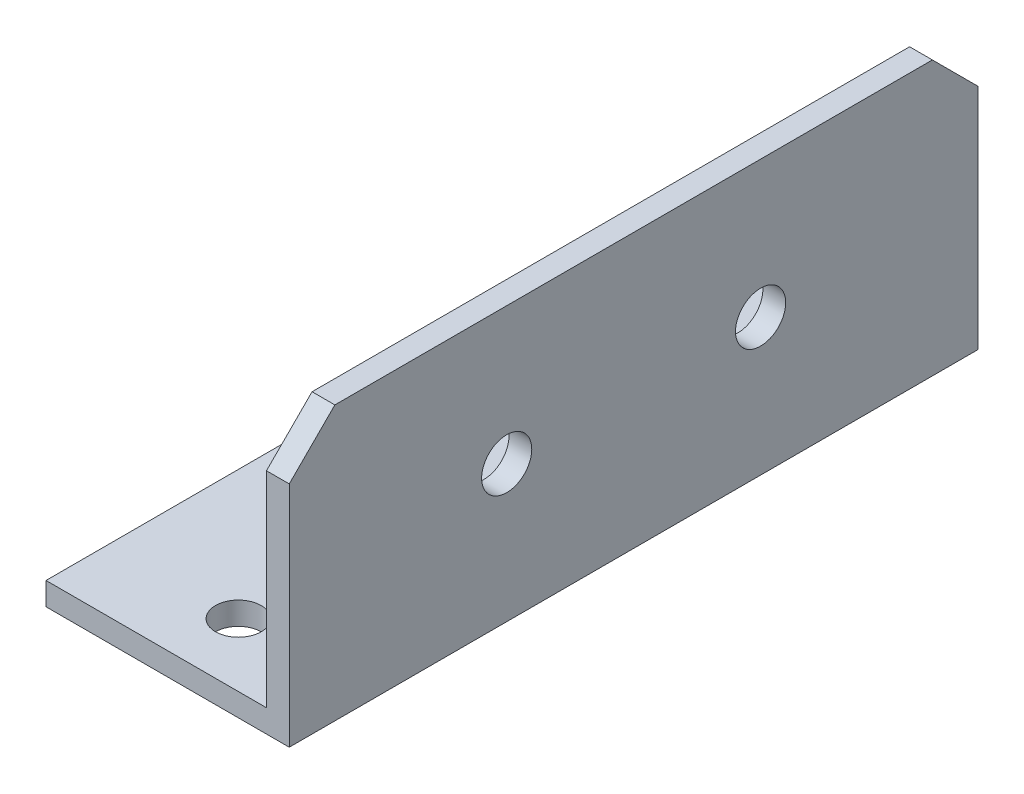
ISO-10303-21;
HEADER;
FILE_DESCRIPTION(('STEP AP214'),'2;1');
FILE_NAME('part.step','',(''),(''),'','','');
FILE_SCHEMA(('AUTOMOTIVE_DESIGN { 1 0 10303 214 1 1 1 1 }'));
ENDSEC;
DATA;
#1=APPLICATION_CONTEXT('core data for automotive mechanical design processes');
#2=APPLICATION_PROTOCOL_DEFINITION('international standard','automotive_design',2000,#1);
#3=PRODUCT_CONTEXT('',#1,'mechanical');
#4=PRODUCT('Part','Part','',(#3));
#5=PRODUCT_RELATED_PRODUCT_CATEGORY('part','',(#4));
#6=PRODUCT_DEFINITION_FORMATION('','',#4);
#7=PRODUCT_DEFINITION_CONTEXT('part definition',#1,'design');
#8=PRODUCT_DEFINITION('design','',#6,#7);
#9=PRODUCT_DEFINITION_SHAPE('','',#8);
#10=(LENGTH_UNIT() NAMED_UNIT(*) SI_UNIT(.MILLI.,.METRE.));
#11=(NAMED_UNIT(*) PLANE_ANGLE_UNIT() SI_UNIT($,.RADIAN.));
#12=(NAMED_UNIT(*) SI_UNIT($,.STERADIAN.) SOLID_ANGLE_UNIT());
#13=UNCERTAINTY_MEASURE_WITH_UNIT(LENGTH_MEASURE(1.E-05),#10,'distance_accuracy_value','');
#14=(GEOMETRIC_REPRESENTATION_CONTEXT(3) GLOBAL_UNCERTAINTY_ASSIGNED_CONTEXT((#13)) GLOBAL_UNIT_ASSIGNED_CONTEXT((#10,
#11,#12)) REPRESENTATION_CONTEXT('',''));
#15=CARTESIAN_POINT('',(0.,0.,0.));
#16=DIRECTION('',(0.,0.,1.));
#17=DIRECTION('',(1.,0.,0.));
#18=AXIS2_PLACEMENT_3D('',#15,#16,#17);
#19=CARTESIAN_POINT('',(0.,0.,45.3));
#20=DIRECTION('',(-1.,0.,0.));
#21=DIRECTION('',(0.,0.,1.));
#22=AXIS2_PLACEMENT_3D('',#19,#20,#21);
#23=PLANE('',#22);
#24=DIRECTION('',(0.,0.707106781186546,-0.707106781186549));
#25=VECTOR('',#24,1.);
#26=CARTESIAN_POINT('',(0.,30.15,30.1499999999999));
#27=LINE('',#26,#25);
#28=CARTESIAN_POINT('',(0.,15.,45.3));
#29=VERTEX_POINT('',#28);
#30=CARTESIAN_POINT('',(0.,18.,42.3));
#31=VERTEX_POINT('',#30);
#32=EDGE_CURVE('E97',#29,#31,#27,.T.);
#33=ORIENTED_EDGE('',*,*,#32,.F.);
#34=DIRECTION('',(0.,1.,0.));
#35=VECTOR('',#34,1.);
#36=CARTESIAN_POINT('',(0.,0.,45.3));
#37=LINE('',#36,#35);
#38=CARTESIAN_POINT('',(0.,0.,45.3));
#39=VERTEX_POINT('',#38);
#40=EDGE_CURVE('E131',#39,#29,#37,.T.);
#41=ORIENTED_EDGE('',*,*,#40,.F.);
#42=DIRECTION('',(0.,0.,-1.));
#43=VECTOR('',#42,1.);
#44=CARTESIAN_POINT('',(0.,0.,45.3));
#45=LINE('',#44,#43);
#46=CARTESIAN_POINT('',(0.,0.,0.));
#47=VERTEX_POINT('',#46);
#48=EDGE_CURVE('E125',#39,#47,#45,.T.);
#49=ORIENTED_EDGE('',*,*,#48,.T.);
#50=DIRECTION('',(0.,1.,0.));
#51=VECTOR('',#50,1.);
#52=CARTESIAN_POINT('',(0.,0.,0.));
#53=LINE('',#52,#51);
#54=CARTESIAN_POINT('',(0.,15.,0.));
#55=VERTEX_POINT('',#54);
#56=EDGE_CURVE('E140',#47,#55,#53,.T.);
#57=ORIENTED_EDGE('',*,*,#56,.T.);
#58=DIRECTION('',(0.,0.707106781186547,0.707106781186548));
#59=VECTOR('',#58,1.);
#60=CARTESIAN_POINT('',(0.,7.50000000000002,-7.5));
#61=LINE('',#60,#59);
#62=CARTESIAN_POINT('',(0.,18.,3.00000000000001));
#63=VERTEX_POINT('',#62);
#64=EDGE_CURVE('E54',#55,#63,#61,.T.);
#65=ORIENTED_EDGE('',*,*,#64,.T.);
#66=DIRECTION('',(0.,0.,-1.));
#67=VECTOR('',#66,1.);
#68=CARTESIAN_POINT('',(0.,18.,45.3));
#69=LINE('',#68,#67);
#70=EDGE_CURVE('E11',#31,#63,#69,.T.);
#71=ORIENTED_EDGE('',*,*,#70,.F.);
#72=EDGE_LOOP('',(#33,#41,#49,#57,#65,#71));
#73=FACE_BOUND('',#72,.T.);
#74=CARTESIAN_POINT('',(0.,9.,14.3));
#75=DIRECTION('',(-1.,0.,0.));
#76=DIRECTION('',(0.,0.,1.));
#77=AXIS2_PLACEMENT_3D('',#74,#75,#76);
#78=CIRCLE('',#77,1.65);
#79=CARTESIAN_POINT('',(0.,9.,15.95));
#80=VERTEX_POINT('',#79);
#81=EDGE_CURVE('E159',#80,#80,#78,.T.);
#82=ORIENTED_EDGE('',*,*,#81,.T.);
#83=EDGE_LOOP('',(#82));
#84=FACE_BOUND('',#83,.T.);
#85=CARTESIAN_POINT('',(0.,9.,31.));
#86=DIRECTION('',(1.,0.,0.));
#87=DIRECTION('',(0.,0.,-1.));
#88=AXIS2_PLACEMENT_3D('',#85,#86,#87);
#89=CIRCLE('',#88,1.65);
#90=CARTESIAN_POINT('',(0.,9.,29.35));
#91=VERTEX_POINT('',#90);
#92=EDGE_CURVE('E165',#91,#91,#89,.T.);
#93=ORIENTED_EDGE('',*,*,#92,.F.);
#94=EDGE_LOOP('',(#93));
#95=FACE_BOUND('',#94,.T.);
#96=ADVANCED_FACE('F32',(#73,#84,#95),#23,.F.);
#97=CARTESIAN_POINT('',(-1.5,1.5,45.3));
#98=DIRECTION('',(-1.,0.,0.));
#99=DIRECTION('',(0.,0.,1.));
#100=AXIS2_PLACEMENT_3D('',#97,#98,#99);
#101=PLANE('',#100);
#102=DIRECTION('',(0.,1.,0.));
#103=VECTOR('',#102,1.);
#104=CARTESIAN_POINT('',(-1.5,1.5,45.3));
#105=LINE('',#104,#103);
#106=CARTESIAN_POINT('',(-1.5,1.5,45.3));
#107=VERTEX_POINT('',#106);
#108=CARTESIAN_POINT('',(-1.5,15.,45.3));
#109=VERTEX_POINT('',#108);
#110=EDGE_CURVE('E111',#107,#109,#105,.T.);
#111=ORIENTED_EDGE('',*,*,#110,.T.);
#112=DIRECTION('',(0.,0.707106781186546,-0.707106781186549));
#113=VECTOR('',#112,1.);
#114=CARTESIAN_POINT('',(-1.5,30.15,30.1499999999999));
#115=LINE('',#114,#113);
#116=CARTESIAN_POINT('',(-1.5,18.,42.3));
#117=VERTEX_POINT('',#116);
#118=EDGE_CURVE('E46',#109,#117,#115,.T.);
#119=ORIENTED_EDGE('',*,*,#118,.T.);
#120=DIRECTION('',(0.,0.,-1.));
#121=VECTOR('',#120,1.);
#122=CARTESIAN_POINT('',(-1.5,18.,45.3));
#123=LINE('',#122,#121);
#124=CARTESIAN_POINT('',(-1.5,18.,3.00000000000001));
#125=VERTEX_POINT('',#124);
#126=EDGE_CURVE('E39',#117,#125,#123,.T.);
#127=ORIENTED_EDGE('',*,*,#126,.T.);
#128=DIRECTION('',(0.,0.707106781186547,0.707106781186548));
#129=VECTOR('',#128,1.);
#130=CARTESIAN_POINT('',(-1.5,7.50000000000002,-7.5));
#131=LINE('',#130,#129);
#132=CARTESIAN_POINT('',(-1.5,15.,0.));
#133=VERTEX_POINT('',#132);
#134=EDGE_CURVE('E112',#133,#125,#131,.T.);
#135=ORIENTED_EDGE('',*,*,#134,.F.);
#136=DIRECTION('',(0.,1.,0.));
#137=VECTOR('',#136,1.);
#138=CARTESIAN_POINT('',(-1.5,1.5,0.));
#139=LINE('',#138,#137);
#140=CARTESIAN_POINT('',(-1.5,1.5,0.));
#141=VERTEX_POINT('',#140);
#142=EDGE_CURVE('E137',#141,#133,#139,.T.);
#143=ORIENTED_EDGE('',*,*,#142,.F.);
#144=DIRECTION('',(0.,0.,-1.));
#145=VECTOR('',#144,1.);
#146=CARTESIAN_POINT('',(-1.5,1.5,45.3));
#147=LINE('',#146,#145);
#148=EDGE_CURVE('E117',#107,#141,#147,.T.);
#149=ORIENTED_EDGE('',*,*,#148,.F.);
#150=EDGE_LOOP('',(#111,#119,#127,#135,#143,#149));
#151=FACE_BOUND('',#150,.T.);
#152=CARTESIAN_POINT('',(-1.5,9.,14.3));
#153=DIRECTION('',(-1.,0.,0.));
#154=DIRECTION('',(0.,0.,1.));
#155=AXIS2_PLACEMENT_3D('',#152,#153,#154);
#156=CIRCLE('',#155,1.65);
#157=CARTESIAN_POINT('',(-1.5,9.,15.95));
#158=VERTEX_POINT('',#157);
#159=EDGE_CURVE('E102',#158,#158,#156,.T.);
#160=ORIENTED_EDGE('',*,*,#159,.F.);
#161=EDGE_LOOP('',(#160));
#162=FACE_BOUND('',#161,.T.);
#163=CARTESIAN_POINT('',(-1.5,9.,31.));
#164=DIRECTION('',(1.,0.,0.));
#165=DIRECTION('',(0.,0.,-1.));
#166=AXIS2_PLACEMENT_3D('',#163,#164,#165);
#167=CIRCLE('',#166,1.65);
#168=CARTESIAN_POINT('',(-1.5,9.,29.35));
#169=VERTEX_POINT('',#168);
#170=EDGE_CURVE('E162',#169,#169,#167,.T.);
#171=ORIENTED_EDGE('',*,*,#170,.T.);
#172=EDGE_LOOP('',(#171));
#173=FACE_BOUND('',#172,.T.);
#174=ADVANCED_FACE('F106',(#151,#162,#173),#101,.T.);
#175=CARTESIAN_POINT('',(-1.5,18.,45.3));
#176=DIRECTION('',(0.,1.,0.));
#177=DIRECTION('',(0.,0.,1.));
#178=AXIS2_PLACEMENT_3D('',#175,#176,#177);
#179=PLANE('',#178);
#180=ORIENTED_EDGE('',*,*,#126,.F.);
#181=DIRECTION('',(-1.,0.,0.));
#182=VECTOR('',#181,1.);
#183=CARTESIAN_POINT('',(0.,18.,42.3));
#184=LINE('',#183,#182);
#185=EDGE_CURVE('E94',#31,#117,#184,.T.);
#186=ORIENTED_EDGE('',*,*,#185,.F.);
#187=ORIENTED_EDGE('',*,*,#70,.T.);
#188=DIRECTION('',(-1.,0.,0.));
#189=VECTOR('',#188,1.);
#190=CARTESIAN_POINT('',(0.,18.,3.00000000000001));
#191=LINE('',#190,#189);
#192=EDGE_CURVE('E116',#63,#125,#191,.T.);
#193=ORIENTED_EDGE('',*,*,#192,.T.);
#194=EDGE_LOOP('',(#180,#186,#187,#193));
#195=FACE_BOUND('',#194,.T.);
#196=ADVANCED_FACE('F115',(#195),#179,.T.);
#197=CARTESIAN_POINT('',(0.,0.,45.3));
#198=DIRECTION('',(0.,0.,-1.));
#199=DIRECTION('',(-1.,0.,0.));
#200=AXIS2_PLACEMENT_3D('',#197,#198,#199);
#201=PLANE('',#200);
#202=DIRECTION('',(-1.,0.,0.));
#203=VECTOR('',#202,1.);
#204=CARTESIAN_POINT('',(0.,15.,45.3));
#205=LINE('',#204,#203);
#206=EDGE_CURVE('E101',#29,#109,#205,.T.);
#207=ORIENTED_EDGE('',*,*,#206,.T.);
#208=ORIENTED_EDGE('',*,*,#110,.F.);
#209=DIRECTION('',(-1.,0.,0.));
#210=VECTOR('',#209,1.);
#211=CARTESIAN_POINT('',(-1.5,1.5,45.3));
#212=LINE('',#211,#210);
#213=CARTESIAN_POINT('',(-16.,1.5,45.3));
#214=VERTEX_POINT('',#213);
#215=EDGE_CURVE('E147',#107,#214,#212,.T.);
#216=ORIENTED_EDGE('',*,*,#215,.T.);
#217=DIRECTION('',(0.,-1.,0.));
#218=VECTOR('',#217,1.);
#219=CARTESIAN_POINT('',(-16.,1.5,45.3));
#220=LINE('',#219,#218);
#221=CARTESIAN_POINT('',(-16.,0.,45.3));
#222=VERTEX_POINT('',#221);
#223=EDGE_CURVE('E145',#214,#222,#220,.T.);
#224=ORIENTED_EDGE('',*,*,#223,.T.);
#225=DIRECTION('',(-1.,0.,0.));
#226=VECTOR('',#225,1.);
#227=CARTESIAN_POINT('',(0.,0.,45.3));
#228=LINE('',#227,#226);
#229=EDGE_CURVE('E127',#39,#222,#228,.T.);
#230=ORIENTED_EDGE('',*,*,#229,.F.);
#231=ORIENTED_EDGE('',*,*,#40,.T.);
#232=EDGE_LOOP('',(#207,#208,#216,#224,#230,#231));
#233=FACE_BOUND('',#232,.T.);
#234=ADVANCED_FACE('F197',(#233),#201,.F.);
#235=CARTESIAN_POINT('',(-1.5,1.5,45.3));
#236=DIRECTION('',(0.,-1.,0.));
#237=DIRECTION('',(0.,0.,-1.));
#238=AXIS2_PLACEMENT_3D('',#235,#236,#237);
#239=PLANE('',#238);
#240=CARTESIAN_POINT('',(-7.5,1.5,41.15));
#241=DIRECTION('',(0.,1.,0.));
#242=DIRECTION('',(0.,0.,-1.));
#243=AXIS2_PLACEMENT_3D('',#240,#241,#242);
#244=CIRCLE('',#243,1.5);
#245=CARTESIAN_POINT('',(-7.5,1.5,39.65));
#246=VERTEX_POINT('',#245);
#247=EDGE_CURVE('E177',#246,#246,#244,.T.);
#248=ORIENTED_EDGE('',*,*,#247,.F.);
#249=EDGE_LOOP('',(#248));
#250=FACE_BOUND('',#249,.T.);
#251=CARTESIAN_POINT('',(-7.50000000000001,1.5,4.14999999999999));
#252=DIRECTION('',(0.,1.,0.));
#253=DIRECTION('',(0.,0.,1.));
#254=AXIS2_PLACEMENT_3D('',#251,#252,#253);
#255=CIRCLE('',#254,1.5);
#256=CARTESIAN_POINT('',(-7.50000000000001,1.5,5.64999999999999));
#257=VERTEX_POINT('',#256);
#258=EDGE_CURVE('E171',#257,#257,#255,.T.);
#259=ORIENTED_EDGE('',*,*,#258,.F.);
#260=EDGE_LOOP('',(#259));
#261=FACE_BOUND('',#260,.T.);
#262=DIRECTION('',(-1.,0.,0.));
#263=VECTOR('',#262,1.);
#264=CARTESIAN_POINT('',(-1.5,1.5,0.));
#265=LINE('',#264,#263);
#266=CARTESIAN_POINT('',(-16.,1.5,0.));
#267=VERTEX_POINT('',#266);
#268=EDGE_CURVE('E135',#141,#267,#265,.T.);
#269=ORIENTED_EDGE('',*,*,#268,.T.);
#270=DIRECTION('',(0.,0.,-1.));
#271=VECTOR('',#270,1.);
#272=CARTESIAN_POINT('',(-16.,1.5,45.3));
#273=LINE('',#272,#271);
#274=EDGE_CURVE('E118',#214,#267,#273,.T.);
#275=ORIENTED_EDGE('',*,*,#274,.F.);
#276=ORIENTED_EDGE('',*,*,#215,.F.);
#277=ORIENTED_EDGE('',*,*,#148,.T.);
#278=EDGE_LOOP('',(#269,#275,#276,#277));
#279=FACE_BOUND('',#278,.T.);
#280=ADVANCED_FACE('F193',(#250,#261,#279),#239,.F.);
#281=CARTESIAN_POINT('',(-16.,1.5,45.3));
#282=DIRECTION('',(1.,0.,0.));
#283=DIRECTION('',(0.,0.,-1.));
#284=AXIS2_PLACEMENT_3D('',#281,#282,#283);
#285=PLANE('',#284);
#286=DIRECTION('',(0.,-1.,0.));
#287=VECTOR('',#286,1.);
#288=CARTESIAN_POINT('',(-16.,1.5,0.));
#289=LINE('',#288,#287);
#290=CARTESIAN_POINT('',(-16.,0.,0.));
#291=VERTEX_POINT('',#290);
#292=EDGE_CURVE('E132',#267,#291,#289,.T.);
#293=ORIENTED_EDGE('',*,*,#292,.T.);
#294=DIRECTION('',(0.,0.,-1.));
#295=VECTOR('',#294,1.);
#296=CARTESIAN_POINT('',(-16.,0.,45.3));
#297=LINE('',#296,#295);
#298=EDGE_CURVE('E123',#222,#291,#297,.T.);
#299=ORIENTED_EDGE('',*,*,#298,.F.);
#300=ORIENTED_EDGE('',*,*,#223,.F.);
#301=ORIENTED_EDGE('',*,*,#274,.T.);
#302=EDGE_LOOP('',(#293,#299,#300,#301));
#303=FACE_BOUND('',#302,.T.);
#304=ADVANCED_FACE('F196',(#303),#285,.F.);
#305=CARTESIAN_POINT('',(0.,0.,45.3));
#306=DIRECTION('',(0.,-1.,0.));
#307=DIRECTION('',(1.,0.,0.));
#308=AXIS2_PLACEMENT_3D('',#305,#306,#307);
#309=PLANE('',#308);
#310=CARTESIAN_POINT('',(-7.5,0.,41.15));
#311=DIRECTION('',(0.,1.,0.));
#312=DIRECTION('',(0.,0.,-1.));
#313=AXIS2_PLACEMENT_3D('',#310,#311,#312);
#314=CIRCLE('',#313,1.5);
#315=CARTESIAN_POINT('',(-7.5,0.,39.65));
#316=VERTEX_POINT('',#315);
#317=EDGE_CURVE('E174',#316,#316,#314,.T.);
#318=ORIENTED_EDGE('',*,*,#317,.T.);
#319=EDGE_LOOP('',(#318));
#320=FACE_BOUND('',#319,.T.);
#321=CARTESIAN_POINT('',(-7.50000000000001,0.,4.14999999999999));
#322=DIRECTION('',(0.,1.,0.));
#323=DIRECTION('',(0.,0.,1.));
#324=AXIS2_PLACEMENT_3D('',#321,#322,#323);
#325=CIRCLE('',#324,1.5);
#326=CARTESIAN_POINT('',(-7.50000000000001,0.,5.64999999999999));
#327=VERTEX_POINT('',#326);
#328=EDGE_CURVE('E168',#327,#327,#325,.T.);
#329=ORIENTED_EDGE('',*,*,#328,.T.);
#330=EDGE_LOOP('',(#329));
#331=FACE_BOUND('',#330,.T.);
#332=DIRECTION('',(-1.,0.,0.));
#333=VECTOR('',#332,1.);
#334=CARTESIAN_POINT('',(0.,0.,0.));
#335=LINE('',#334,#333);
#336=EDGE_CURVE('E128',#47,#291,#335,.T.);
#337=ORIENTED_EDGE('',*,*,#336,.F.);
#338=ORIENTED_EDGE('',*,*,#48,.F.);
#339=ORIENTED_EDGE('',*,*,#229,.T.);
#340=ORIENTED_EDGE('',*,*,#298,.T.);
#341=EDGE_LOOP('',(#337,#338,#339,#340));
#342=FACE_BOUND('',#341,.T.);
#343=ADVANCED_FACE('F183',(#320,#331,#342),#309,.T.);
#344=CARTESIAN_POINT('',(0.,0.,0.));
#345=DIRECTION('',(0.,0.,-1.));
#346=DIRECTION('',(-1.,0.,0.));
#347=AXIS2_PLACEMENT_3D('',#344,#345,#346);
#348=PLANE('',#347);
#349=DIRECTION('',(-1.,0.,0.));
#350=VECTOR('',#349,1.);
#351=CARTESIAN_POINT('',(0.,15.,0.));
#352=LINE('',#351,#350);
#353=EDGE_CURVE('E152',#55,#133,#352,.T.);
#354=ORIENTED_EDGE('',*,*,#353,.F.);
#355=ORIENTED_EDGE('',*,*,#56,.F.);
#356=ORIENTED_EDGE('',*,*,#336,.T.);
#357=ORIENTED_EDGE('',*,*,#292,.F.);
#358=ORIENTED_EDGE('',*,*,#268,.F.);
#359=ORIENTED_EDGE('',*,*,#142,.T.);
#360=EDGE_LOOP('',(#354,#355,#356,#357,#358,#359));
#361=FACE_BOUND('',#360,.T.);
#362=ADVANCED_FACE('F210',(#361),#348,.T.);
#363=CARTESIAN_POINT('',(0.,7.50000000000002,-7.5));
#364=DIRECTION('',(0.,-0.707106781186548,0.707106781186547));
#365=DIRECTION('',(0.,-0.707106781186547,-0.707106781186548));
#366=AXIS2_PLACEMENT_3D('',#363,#364,#365);
#367=PLANE('',#366);
#368=ORIENTED_EDGE('',*,*,#134,.T.);
#369=ORIENTED_EDGE('',*,*,#192,.F.);
#370=ORIENTED_EDGE('',*,*,#64,.F.);
#371=ORIENTED_EDGE('',*,*,#353,.T.);
#372=EDGE_LOOP('',(#368,#369,#370,#371));
#373=FACE_BOUND('',#372,.T.);
#374=ADVANCED_FACE('F219',(#373),#367,.F.);
#375=CARTESIAN_POINT('',(0.,30.15,30.1499999999999));
#376=DIRECTION('',(0.,0.707106781186549,0.707106781186546));
#377=DIRECTION('',(0.,-0.707106781186546,0.707106781186549));
#378=AXIS2_PLACEMENT_3D('',#375,#376,#377);
#379=PLANE('',#378);
#380=ORIENTED_EDGE('',*,*,#118,.F.);
#381=ORIENTED_EDGE('',*,*,#206,.F.);
#382=ORIENTED_EDGE('',*,*,#32,.T.);
#383=ORIENTED_EDGE('',*,*,#185,.T.);
#384=EDGE_LOOP('',(#380,#381,#382,#383));
#385=FACE_BOUND('',#384,.T.);
#386=ADVANCED_FACE('F95',(#385),#379,.T.);
#387=CARTESIAN_POINT('',(0.,9.,14.3));
#388=DIRECTION('',(-1.,0.,0.));
#389=DIRECTION('',(0.,0.,1.));
#390=AXIS2_PLACEMENT_3D('',#387,#388,#389);
#391=CYLINDRICAL_SURFACE('',#390,1.65);
#392=ORIENTED_EDGE('',*,*,#81,.F.);
#393=EDGE_LOOP('',(#392));
#394=FACE_BOUND('',#393,.T.);
#395=ORIENTED_EDGE('',*,*,#159,.T.);
#396=EDGE_LOOP('',(#395));
#397=FACE_BOUND('',#396,.T.);
#398=ADVANCED_FACE('F226',(#394,#397),#391,.F.);
#399=CARTESIAN_POINT('',(0.,9.,31.));
#400=DIRECTION('',(-1.,0.,0.));
#401=DIRECTION('',(0.,0.,1.));
#402=AXIS2_PLACEMENT_3D('',#399,#400,#401);
#403=CYLINDRICAL_SURFACE('',#402,1.65);
#404=ORIENTED_EDGE('',*,*,#92,.T.);
#405=EDGE_LOOP('',(#404));
#406=FACE_BOUND('',#405,.T.);
#407=ORIENTED_EDGE('',*,*,#170,.F.);
#408=EDGE_LOOP('',(#407));
#409=FACE_BOUND('',#408,.T.);
#410=ADVANCED_FACE('F284',(#406,#409),#403,.F.);
#411=CARTESIAN_POINT('',(-7.50000000000001,0.,4.14999999999999));
#412=DIRECTION('',(0.,1.,0.));
#413=DIRECTION('',(0.,0.,1.));
#414=AXIS2_PLACEMENT_3D('',#411,#412,#413);
#415=CYLINDRICAL_SURFACE('',#414,1.5);
#416=ORIENTED_EDGE('',*,*,#328,.F.);
#417=EDGE_LOOP('',(#416));
#418=FACE_BOUND('',#417,.T.);
#419=ORIENTED_EDGE('',*,*,#258,.T.);
#420=EDGE_LOOP('',(#419));
#421=FACE_BOUND('',#420,.T.);
#422=ADVANCED_FACE('F189',(#418,#421),#415,.F.);
#423=CARTESIAN_POINT('',(-7.5,0.,41.15));
#424=DIRECTION('',(0.,1.,0.));
#425=DIRECTION('',(0.,0.,1.));
#426=AXIS2_PLACEMENT_3D('',#423,#424,#425);
#427=CYLINDRICAL_SURFACE('',#426,1.5);
#428=ORIENTED_EDGE('',*,*,#317,.F.);
#429=EDGE_LOOP('',(#428));
#430=FACE_BOUND('',#429,.T.);
#431=ORIENTED_EDGE('',*,*,#247,.T.);
#432=EDGE_LOOP('',(#431));
#433=FACE_BOUND('',#432,.T.);
#434=ADVANCED_FACE('F186',(#430,#433),#427,.F.);
#435=CLOSED_SHELL('',(#96,#174,#196,#234,#280,#304,#343,#362,#374,#386,#398,#410,#422,#434));
#436=MANIFOLD_SOLID_BREP('B2',#435);
#437=ADVANCED_BREP_SHAPE_REPRESENTATION('',(#18,#436),#14);
#438=SHAPE_DEFINITION_REPRESENTATION(#9,#437);
ENDSEC;
END-ISO-10303-21;
